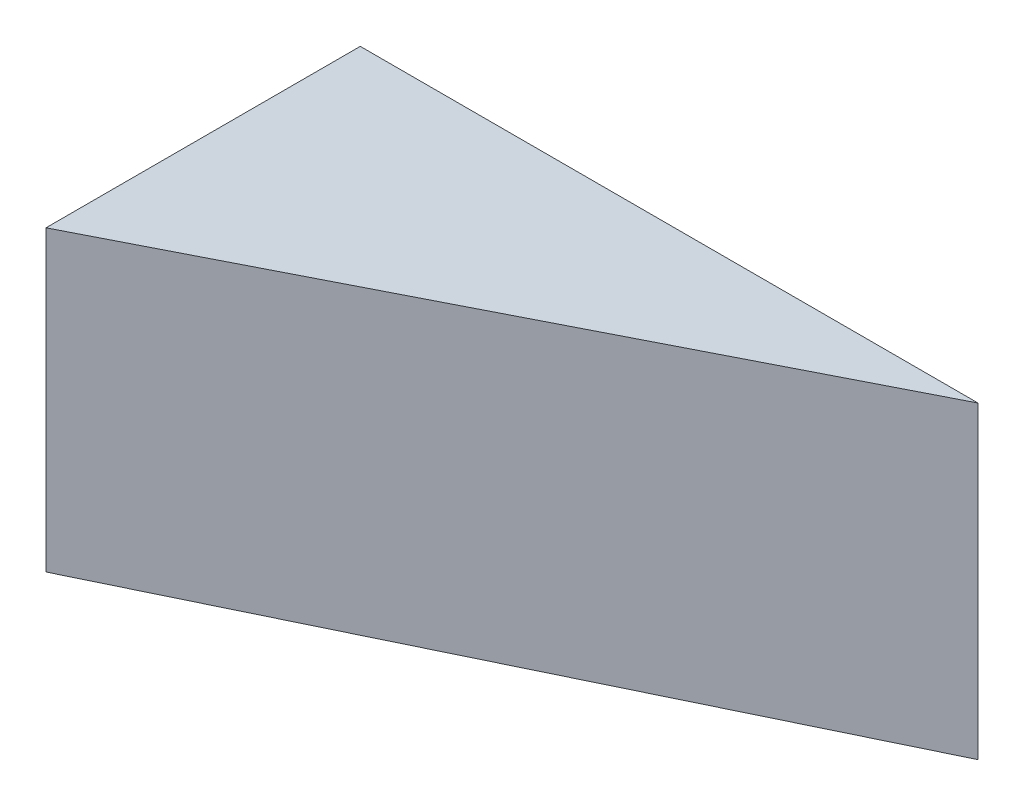
ISO-10303-21;
HEADER;
FILE_DESCRIPTION(('STEP AP214'),'2;1');
FILE_NAME('part.step','',(''),(''),'','','');
FILE_SCHEMA(('AUTOMOTIVE_DESIGN { 1 0 10303 214 1 1 1 1 }'));
ENDSEC;
DATA;
#1=APPLICATION_CONTEXT('core data for automotive mechanical design processes');
#2=APPLICATION_PROTOCOL_DEFINITION('international standard','automotive_design',2000,#1);
#3=PRODUCT_CONTEXT('',#1,'mechanical');
#4=PRODUCT('Part','Part','',(#3));
#5=PRODUCT_RELATED_PRODUCT_CATEGORY('part','',(#4));
#6=PRODUCT_DEFINITION_FORMATION('','',#4);
#7=PRODUCT_DEFINITION_CONTEXT('part definition',#1,'design');
#8=PRODUCT_DEFINITION('design','',#6,#7);
#9=PRODUCT_DEFINITION_SHAPE('','',#8);
#10=(LENGTH_UNIT() NAMED_UNIT(*) SI_UNIT(.MILLI.,.METRE.));
#11=(NAMED_UNIT(*) PLANE_ANGLE_UNIT() SI_UNIT($,.RADIAN.));
#12=(NAMED_UNIT(*) SI_UNIT($,.STERADIAN.) SOLID_ANGLE_UNIT());
#13=UNCERTAINTY_MEASURE_WITH_UNIT(LENGTH_MEASURE(1.E-05),#10,'distance_accuracy_value','');
#14=(GEOMETRIC_REPRESENTATION_CONTEXT(3) GLOBAL_UNCERTAINTY_ASSIGNED_CONTEXT((#13)) GLOBAL_UNIT_ASSIGNED_CONTEXT((#10,
#11,#12)) REPRESENTATION_CONTEXT('',''));
#15=CARTESIAN_POINT('',(0.,0.,0.));
#16=DIRECTION('',(0.,0.,1.));
#17=DIRECTION('',(1.,0.,0.));
#18=AXIS2_PLACEMENT_3D('',#15,#16,#17);
#19=CARTESIAN_POINT('',(-36.,-16.2400000000128,-3.80000000032274));
#20=DIRECTION('',(0.,0.999847695156302,0.0174524064423862));
#21=DIRECTION('',(-1.,0.,0.));
#22=AXIS2_PLACEMENT_3D('',#19,#20,#21);
#23=PLANE('',#22);
#24=DIRECTION('',(0.895945290652462,0.00775173806688894,-0.444096776293882));
#25=VECTOR('',#24,1.);
#26=CARTESIAN_POINT('',(-32.0575279287473,-16.2401201788988,-3.79311495655239));
#27=LINE('',#26,#25);
#28=CARTESIAN_POINT('',(-36.078547792177,-16.2749101298794,-1.80000000032291));
#29=VERTEX_POINT('',#28);
#30=CARTESIAN_POINT('',(-32.0436376623205,-16.2400000000128,-3.80000000032274));
#31=VERTEX_POINT('',#30);
#32=EDGE_CURVE('E80',#29,#31,#27,.T.);
#33=ORIENTED_EDGE('',*,*,#32,.T.);
#34=DIRECTION('',(-1.,0.,0.));
#35=VECTOR('',#34,1.);
#36=CARTESIAN_POINT('',(-36.0436376623205,-16.2400000000128,-3.80000000032274));
#37=LINE('',#36,#35);
#38=CARTESIAN_POINT('',(-36.0436376623205,-16.2400000000128,-3.80000000032274));
#39=VERTEX_POINT('',#38);
#40=EDGE_CURVE('E25',#31,#39,#37,.T.);
#41=ORIENTED_EDGE('',*,*,#40,.T.);
#42=DIRECTION('',(-0.0174497491606836,-0.0174497491657845,0.999695459881799));
#43=VECTOR('',#42,1.);
#44=CARTESIAN_POINT('',(-36.0791461497523,-16.2755084874549,-1.76572011779043));
#45=LINE('',#44,#43);
#46=EDGE_CURVE('E76',#39,#29,#45,.T.);
#47=ORIENTED_EDGE('',*,*,#46,.T.);
#48=EDGE_LOOP('',(#33,#41,#47));
#49=FACE_BOUND('',#48,.T.);
#50=ADVANCED_FACE('F16',(#49),#23,.T.);
#51=CARTESIAN_POINT('',(-36.,-18.2400000000127,-3.80000000033295));
#52=DIRECTION('',(0.,-0.99984769515648,0.017452406432181));
#53=DIRECTION('',(1.,0.,0.));
#54=AXIS2_PLACEMENT_3D('',#51,#52,#53);
#55=PLANE('',#54);
#56=DIRECTION('',(0.895945290652462,-0.00775173806235612,-0.444096776293961));
#57=VECTOR('',#56,1.);
#58=CARTESIAN_POINT('',(-32.0436376623205,-18.2400000000127,-3.80000000033295));
#59=LINE('',#58,#57);
#60=CARTESIAN_POINT('',(-36.078547792177,-18.2050898701665,-1.80000000033276));
#61=VERTEX_POINT('',#60);
#62=CARTESIAN_POINT('',(-32.0436376623205,-18.2400000000127,-3.80000000033295));
#63=VERTEX_POINT('',#62);
#64=EDGE_CURVE('E64',#61,#63,#59,.T.);
#65=ORIENTED_EDGE('',*,*,#64,.F.);
#66=DIRECTION('',(-0.0174497491606836,0.0174497491555808,0.999695459881977));
#67=VECTOR('',#66,1.);
#68=CARTESIAN_POINT('',(-36.0785371622608,-18.2051005000828,-1.8006089878243));
#69=LINE('',#68,#67);
#70=CARTESIAN_POINT('',(-36.0436376623205,-18.2400000000127,-3.80000000033295));
#71=VERTEX_POINT('',#70);
#72=EDGE_CURVE('E66',#71,#61,#69,.T.);
#73=ORIENTED_EDGE('',*,*,#72,.F.);
#74=DIRECTION('',(-1.,0.,0.));
#75=VECTOR('',#74,1.);
#76=CARTESIAN_POINT('',(-36.0436376623205,-18.2400000000127,-3.80000000033295));
#77=LINE('',#76,#75);
#78=EDGE_CURVE('E11',#63,#71,#77,.T.);
#79=ORIENTED_EDGE('',*,*,#78,.F.);
#80=EDGE_LOOP('',(#65,#73,#79));
#81=FACE_BOUND('',#80,.T.);
#82=ADVANCED_FACE('F18',(#81),#55,.T.);
#83=CARTESIAN_POINT('',(-36.0436376623205,-18.2400000000127,-3.80000000033295));
#84=DIRECTION('',(0.,5.10341196927923E-12,-1.));
#85=DIRECTION('',(0.,1.,5.10341196927923E-12));
#86=AXIS2_PLACEMENT_3D('',#83,#84,#85);
#87=PLANE('',#86);
#88=DIRECTION('',(0.,1.,5.10341196927923E-12));
#89=VECTOR('',#88,1.);
#90=CARTESIAN_POINT('',(-36.0436376623205,-18.2400000000127,-3.80000000033295));
#91=LINE('',#90,#89);
#92=EDGE_CURVE('E91',#71,#39,#91,.T.);
#93=ORIENTED_EDGE('',*,*,#92,.T.);
#94=ORIENTED_EDGE('',*,*,#40,.F.);
#95=DIRECTION('',(0.,1.,5.10341196927923E-12));
#96=VECTOR('',#95,1.);
#97=CARTESIAN_POINT('',(-32.0436376623205,-18.2400000000127,-3.80000000033295));
#98=LINE('',#97,#96);
#99=EDGE_CURVE('E72',#63,#31,#98,.T.);
#100=ORIENTED_EDGE('',*,*,#99,.F.);
#101=ORIENTED_EDGE('',*,*,#78,.T.);
#102=EDGE_LOOP('',(#93,#94,#100,#101));
#103=FACE_BOUND('',#102,.T.);
#104=ADVANCED_FACE('F78',(#103),#87,.T.);
#105=CARTESIAN_POINT('',(-36.078547792177,-18.2400000000229,-1.80000000033294));
#106=DIRECTION('',(-0.999847695156391,0.,-0.0174524064372844));
#107=DIRECTION('',(-0.0174524064372844,-5.10263469491738E-12,0.999847695156391));
#108=AXIS2_PLACEMENT_3D('',#105,#106,#107);
#109=PLANE('',#108);
#110=DIRECTION('',(0.,1.,5.10341196927923E-12));
#111=VECTOR('',#110,1.);
#112=CARTESIAN_POINT('',(-36.078547792177,-18.2400000000229,-1.80000000033294));
#113=LINE('',#112,#111);
#114=EDGE_CURVE('E74',#61,#29,#113,.T.);
#115=ORIENTED_EDGE('',*,*,#114,.T.);
#116=ORIENTED_EDGE('',*,*,#46,.F.);
#117=ORIENTED_EDGE('',*,*,#92,.F.);
#118=ORIENTED_EDGE('',*,*,#72,.T.);
#119=EDGE_LOOP('',(#115,#116,#117,#118));
#120=FACE_BOUND('',#119,.T.);
#121=ADVANCED_FACE('F100',(#120),#109,.T.);
#122=CARTESIAN_POINT('',(-32.0436376623205,-18.2400000000127,-3.80000000033295));
#123=DIRECTION('',(0.444110119659238,-4.57251530214783E-12,0.895972210292405));
#124=DIRECTION('',(0.,1.,5.10341196927923E-12));
#125=AXIS2_PLACEMENT_3D('',#122,#123,#124);
#126=PLANE('',#125);
#127=ORIENTED_EDGE('',*,*,#99,.T.);
#128=ORIENTED_EDGE('',*,*,#32,.F.);
#129=ORIENTED_EDGE('',*,*,#114,.F.);
#130=ORIENTED_EDGE('',*,*,#64,.T.);
#131=EDGE_LOOP('',(#127,#128,#129,#130));
#132=FACE_BOUND('',#131,.T.);
#133=ADVANCED_FACE('F70',(#132),#126,.T.);
#134=CLOSED_SHELL('',(#50,#82,#104,#121,#133));
#135=MANIFOLD_SOLID_BREP('B1',#134);
#136=ADVANCED_BREP_SHAPE_REPRESENTATION('',(#18,#135),#14);
#137=SHAPE_DEFINITION_REPRESENTATION(#9,#136);
ENDSEC;
END-ISO-10303-21;
